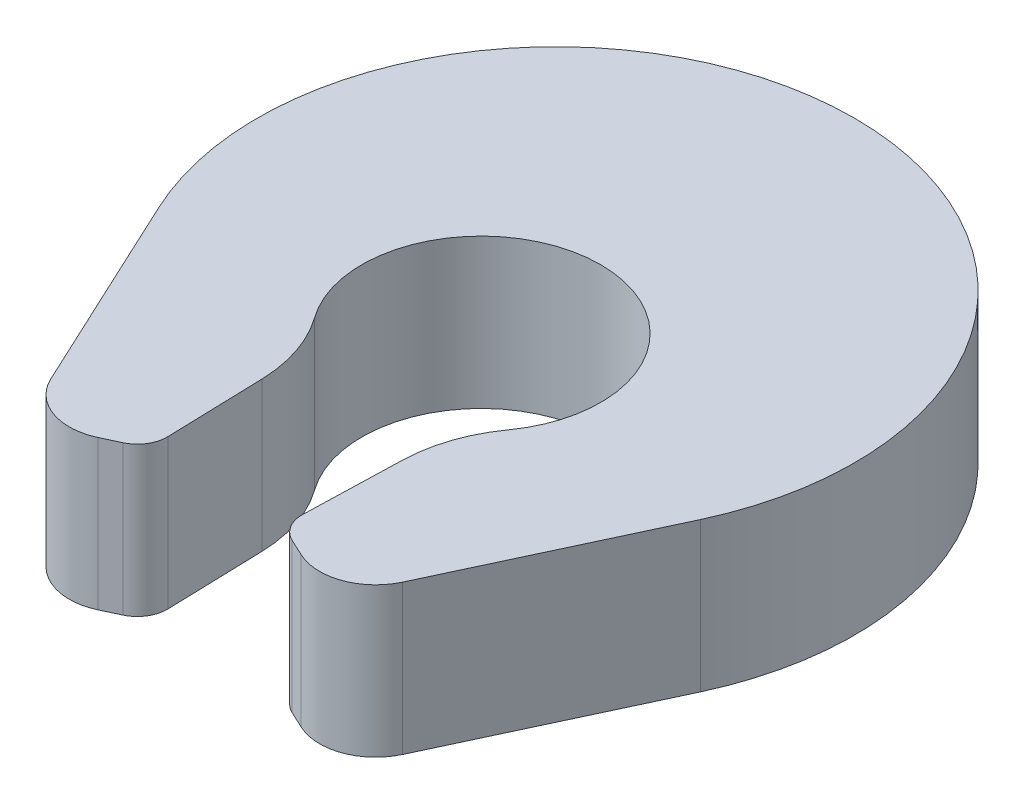
ISO-10303-21;
HEADER;
FILE_DESCRIPTION(('STEP AP214'),'2;1');
FILE_NAME('part.step','',(''),(''),'','','');
FILE_SCHEMA(('AUTOMOTIVE_DESIGN { 1 0 10303 214 1 1 1 1 }'));
ENDSEC;
DATA;
#1=APPLICATION_CONTEXT('core data for automotive mechanical design processes');
#2=APPLICATION_PROTOCOL_DEFINITION('international standard','automotive_design',2000,#1);
#3=PRODUCT_CONTEXT('',#1,'mechanical');
#4=PRODUCT('Part','Part','',(#3));
#5=PRODUCT_RELATED_PRODUCT_CATEGORY('part','',(#4));
#6=PRODUCT_DEFINITION_FORMATION('','',#4);
#7=PRODUCT_DEFINITION_CONTEXT('part definition',#1,'design');
#8=PRODUCT_DEFINITION('design','',#6,#7);
#9=PRODUCT_DEFINITION_SHAPE('','',#8);
#10=(LENGTH_UNIT() NAMED_UNIT(*) SI_UNIT(.MILLI.,.METRE.));
#11=(NAMED_UNIT(*) PLANE_ANGLE_UNIT() SI_UNIT($,.RADIAN.));
#12=(NAMED_UNIT(*) SI_UNIT($,.STERADIAN.) SOLID_ANGLE_UNIT());
#13=UNCERTAINTY_MEASURE_WITH_UNIT(LENGTH_MEASURE(1.E-05),#10,'distance_accuracy_value','');
#14=(GEOMETRIC_REPRESENTATION_CONTEXT(3) GLOBAL_UNCERTAINTY_ASSIGNED_CONTEXT((#13)) GLOBAL_UNIT_ASSIGNED_CONTEXT((#10,
#11,#12)) REPRESENTATION_CONTEXT('',''));
#15=CARTESIAN_POINT('',(0.,0.,0.));
#16=DIRECTION('',(0.,0.,1.));
#17=DIRECTION('',(1.,0.,0.));
#18=AXIS2_PLACEMENT_3D('',#15,#16,#17);
#19=CARTESIAN_POINT('',(0.,2.,0.));
#20=DIRECTION('',(0.,-1.,0.));
#21=DIRECTION('',(0.,0.,-1.));
#22=AXIS2_PLACEMENT_3D('',#19,#20,#21);
#23=CYLINDRICAL_SURFACE('',#22,4.);
#24=CARTESIAN_POINT('',(0.,0.,0.));
#25=DIRECTION('',(0.,1.,0.));
#26=DIRECTION('',(0.,0.,-1.));
#27=AXIS2_PLACEMENT_3D('',#24,#25,#26);
#28=CIRCLE('',#27,4.);
#29=CARTESIAN_POINT('',(3.62523114814661,0.,1.69047304696278));
#30=VERTEX_POINT('',#29);
#31=CARTESIAN_POINT('',(-3.62523114814661,0.,1.69047304696278));
#32=VERTEX_POINT('',#31);
#33=EDGE_CURVE('E169',#30,#32,#28,.T.);
#34=ORIENTED_EDGE('',*,*,#33,.T.);
#35=DIRECTION('',(0.,-1.,0.));
#36=VECTOR('',#35,1.);
#37=CARTESIAN_POINT('',(-3.62523114814661,2.,1.69047304696278));
#38=LINE('',#37,#36);
#39=CARTESIAN_POINT('',(-3.62523114814661,2.,1.69047304696278));
#40=VERTEX_POINT('',#39);
#41=EDGE_CURVE('E11',#40,#32,#38,.T.);
#42=ORIENTED_EDGE('',*,*,#41,.F.);
#43=CARTESIAN_POINT('',(0.,2.,0.));
#44=DIRECTION('',(0.,1.,0.));
#45=DIRECTION('',(0.,0.,-1.));
#46=AXIS2_PLACEMENT_3D('',#43,#44,#45);
#47=CIRCLE('',#46,4.);
#48=CARTESIAN_POINT('',(3.62523114814661,2.,1.69047304696278));
#49=VERTEX_POINT('',#48);
#50=EDGE_CURVE('E195',#49,#40,#47,.T.);
#51=ORIENTED_EDGE('',*,*,#50,.F.);
#52=DIRECTION('',(0.,-1.,0.));
#53=VECTOR('',#52,1.);
#54=CARTESIAN_POINT('',(3.62523114814661,2.,1.69047304696278));
#55=LINE('',#54,#53);
#56=EDGE_CURVE('E165',#49,#30,#55,.T.);
#57=ORIENTED_EDGE('',*,*,#56,.T.);
#58=EDGE_LOOP('',(#34,#42,#51,#57));
#59=FACE_BOUND('',#58,.T.);
#60=ADVANCED_FACE('F37',(#59),#23,.T.);
#61=CARTESIAN_POINT('',(-3.62523114814661,2.,1.69047304696278));
#62=DIRECTION('',(0.906307787036653,0.,-0.422618261740694));
#63=DIRECTION('',(-0.422618261740694,0.,-0.906307787036653));
#64=AXIS2_PLACEMENT_3D('',#61,#62,#63);
#65=PLANE('',#64);
#66=DIRECTION('',(0.422618261740694,0.,0.906307787036653));
#67=VECTOR('',#66,1.);
#68=CARTESIAN_POINT('',(-3.62523114814661,0.,1.69047304696278));
#69=LINE('',#68,#67);
#70=CARTESIAN_POINT('',(-2.35737636292453,0.,4.40939640807273));
#71=VERTEX_POINT('',#70);
#72=EDGE_CURVE('E172',#32,#71,#69,.T.);
#73=ORIENTED_EDGE('',*,*,#72,.T.);
#74=DIRECTION('',(0.,-1.,0.));
#75=VECTOR('',#74,1.);
#76=CARTESIAN_POINT('',(-2.35737636292453,2.,4.40939640807273));
#77=LINE('',#76,#75);
#78=CARTESIAN_POINT('',(-2.35737636292453,2.,4.40939640807273));
#79=VERTEX_POINT('',#78);
#80=EDGE_CURVE('E45',#79,#71,#77,.T.);
#81=ORIENTED_EDGE('',*,*,#80,.F.);
#82=DIRECTION('',(0.422618261740694,0.,0.906307787036653));
#83=VECTOR('',#82,1.);
#84=CARTESIAN_POINT('',(-3.62523114814661,2.,1.69047304696278));
#85=LINE('',#84,#83);
#86=EDGE_CURVE('E114',#40,#79,#85,.T.);
#87=ORIENTED_EDGE('',*,*,#86,.F.);
#88=ORIENTED_EDGE('',*,*,#41,.T.);
#89=EDGE_LOOP('',(#73,#81,#87,#88));
#90=FACE_BOUND('',#89,.T.);
#91=ADVANCED_FACE('F283',(#90),#65,.F.);
#92=CARTESIAN_POINT('',(-1.67764552264704,2.,4.09243271176721));
#93=DIRECTION('',(0.,-1.,0.));
#94=DIRECTION('',(0.,0.,-1.));
#95=AXIS2_PLACEMENT_3D('',#92,#93,#94);
#96=CYLINDRICAL_SURFACE('',#95,0.749999999999999);
#97=CARTESIAN_POINT('',(-1.67764552264704,0.,4.09243271176721));
#98=DIRECTION('',(0.,1.,0.));
#99=DIRECTION('',(0.,0.,-1.));
#100=AXIS2_PLACEMENT_3D('',#97,#98,#99);
#101=CIRCLE('',#100,0.749999999999999);
#102=CARTESIAN_POINT('',(-1.36068182634152,0.,4.7721635520447));
#103=VERTEX_POINT('',#102);
#104=EDGE_CURVE('E174',#71,#103,#101,.T.);
#105=ORIENTED_EDGE('',*,*,#104,.T.);
#106=DIRECTION('',(0.,-1.,0.));
#107=VECTOR('',#106,1.);
#108=CARTESIAN_POINT('',(-1.36068182634152,2.,4.7721635520447));
#109=LINE('',#108,#107);
#110=CARTESIAN_POINT('',(-1.36068182634152,2.,4.7721635520447));
#111=VERTEX_POINT('',#110);
#112=EDGE_CURVE('E220',#111,#103,#109,.T.);
#113=ORIENTED_EDGE('',*,*,#112,.F.);
#114=CARTESIAN_POINT('',(-1.67764552264704,2.,4.09243271176721));
#115=DIRECTION('',(0.,1.,0.));
#116=DIRECTION('',(0.,0.,-1.));
#117=AXIS2_PLACEMENT_3D('',#114,#115,#116);
#118=CIRCLE('',#117,0.749999999999999);
#119=EDGE_CURVE('E228',#79,#111,#118,.T.);
#120=ORIENTED_EDGE('',*,*,#119,.F.);
#121=ORIENTED_EDGE('',*,*,#80,.T.);
#122=EDGE_LOOP('',(#105,#113,#120,#121));
#123=FACE_BOUND('',#122,.T.);
#124=ADVANCED_FACE('F226',(#123),#96,.T.);
#125=CARTESIAN_POINT('',(-1.13410487958236,2.,4.66650898660953));
#126=DIRECTION('',(-0.422618261740695,0.,-0.906307787036652));
#127=DIRECTION('',(-0.906307787036652,0.,0.422618261740695));
#128=AXIS2_PLACEMENT_3D('',#125,#126,#127);
#129=PLANE('',#128);
#130=DIRECTION('',(0.906307787036652,0.,-0.422618261740695));
#131=VECTOR('',#130,1.);
#132=CARTESIAN_POINT('',(-1.13410487958236,0.,4.66650898660953));
#133=LINE('',#132,#131);
#134=CARTESIAN_POINT('',(-1.13410487958236,0.,4.66650898660953));
#135=VERTEX_POINT('',#134);
#136=EDGE_CURVE('E176',#103,#135,#133,.T.);
#137=ORIENTED_EDGE('',*,*,#136,.T.);
#138=DIRECTION('',(0.,-1.,0.));
#139=VECTOR('',#138,1.);
#140=CARTESIAN_POINT('',(-1.13410487958236,2.,4.66650898660953));
#141=LINE('',#140,#139);
#142=CARTESIAN_POINT('',(-1.13410487958236,2.,4.66650898660953));
#143=VERTEX_POINT('',#142);
#144=EDGE_CURVE('E217',#143,#135,#141,.T.);
#145=ORIENTED_EDGE('',*,*,#144,.F.);
#146=DIRECTION('',(0.906307787036652,0.,-0.422618261740695));
#147=VECTOR('',#146,1.);
#148=CARTESIAN_POINT('',(-1.13410487958236,2.,4.66650898660953));
#149=LINE('',#148,#147);
#150=EDGE_CURVE('E246',#111,#143,#149,.T.);
#151=ORIENTED_EDGE('',*,*,#150,.F.);
#152=ORIENTED_EDGE('',*,*,#112,.T.);
#153=EDGE_LOOP('',(#137,#145,#151,#152));
#154=FACE_BOUND('',#153,.T.);
#155=ADVANCED_FACE('F237',(#154),#129,.F.);
#156=CARTESIAN_POINT('',(-1.30315218427863,2.,4.30398587179487));
#157=DIRECTION('',(0.,-1.,0.));
#158=DIRECTION('',(0.,0.,-1.));
#159=AXIS2_PLACEMENT_3D('',#156,#157,#158);
#160=CYLINDRICAL_SURFACE('',#159,0.399999999999999);
#161=CARTESIAN_POINT('',(-1.30315218427863,0.,4.30398587179487));
#162=DIRECTION('',(0.,1.,0.));
#163=DIRECTION('',(0.,0.,-1.));
#164=AXIS2_PLACEMENT_3D('',#161,#162,#163);
#165=CIRCLE('',#164,0.399999999999999);
#166=CARTESIAN_POINT('',(-0.903326596229223,0.,4.29217489635075));
#167=VERTEX_POINT('',#166);
#168=EDGE_CURVE('E178',#135,#167,#165,.T.);
#169=ORIENTED_EDGE('',*,*,#168,.T.);
#170=DIRECTION('',(0.,-1.,0.));
#171=VECTOR('',#170,1.);
#172=CARTESIAN_POINT('',(-0.903326596229223,2.,4.29217489635075));
#173=LINE('',#172,#171);
#174=CARTESIAN_POINT('',(-0.903326596229223,2.,4.29217489635075));
#175=VERTEX_POINT('',#174);
#176=EDGE_CURVE('E214',#175,#167,#173,.T.);
#177=ORIENTED_EDGE('',*,*,#176,.F.);
#178=CARTESIAN_POINT('',(-1.30315218427863,2.,4.30398587179487));
#179=DIRECTION('',(0.,1.,0.));
#180=DIRECTION('',(0.,0.,-1.));
#181=AXIS2_PLACEMENT_3D('',#178,#179,#180);
#182=CIRCLE('',#181,0.399999999999999);
#183=EDGE_CURVE('E243',#143,#175,#182,.T.);
#184=ORIENTED_EDGE('',*,*,#183,.F.);
#185=ORIENTED_EDGE('',*,*,#144,.T.);
#186=EDGE_LOOP('',(#169,#177,#184,#185));
#187=FACE_BOUND('',#186,.T.);
#188=ADVANCED_FACE('F241',(#187),#160,.T.);
#189=CARTESIAN_POINT('',(-0.941712266422619,2.,2.99274173519016));
#190=DIRECTION('',(-0.999563970123531,0.,0.0295274386103057));
#191=DIRECTION('',(0.0295274386103057,0.,0.999563970123531));
#192=AXIS2_PLACEMENT_3D('',#189,#190,#191);
#193=PLANE('',#192);
#194=DIRECTION('',(-0.0295274386103057,0.,-0.999563970123531));
#195=VECTOR('',#194,1.);
#196=CARTESIAN_POINT('',(-0.941712266422619,0.,2.99274173519016));
#197=LINE('',#196,#195);
#198=CARTESIAN_POINT('',(-0.941712266422619,0.,2.99274173519016));
#199=VERTEX_POINT('',#198);
#200=EDGE_CURVE('E180',#167,#199,#197,.T.);
#201=ORIENTED_EDGE('',*,*,#200,.T.);
#202=DIRECTION('',(0.,-1.,0.));
#203=VECTOR('',#202,1.);
#204=CARTESIAN_POINT('',(-0.941712266422619,2.,2.99274173519016));
#205=LINE('',#204,#203);
#206=CARTESIAN_POINT('',(-0.941712266422619,2.,2.99274173519016));
#207=VERTEX_POINT('',#206);
#208=EDGE_CURVE('E211',#207,#199,#205,.T.);
#209=ORIENTED_EDGE('',*,*,#208,.F.);
#210=DIRECTION('',(-0.0295274386103057,0.,-0.999563970123531));
#211=VECTOR('',#210,1.);
#212=CARTESIAN_POINT('',(-0.941712266422619,2.,2.99274173519016));
#213=LINE('',#212,#211);
#214=EDGE_CURVE('E245',#175,#207,#213,.T.);
#215=ORIENTED_EDGE('',*,*,#214,.F.);
#216=ORIENTED_EDGE('',*,*,#176,.T.);
#217=EDGE_LOOP('',(#201,#209,#215,#216));
#218=FACE_BOUND('',#217,.T.);
#219=ADVANCED_FACE('F296',(#218),#193,.F.);
#220=CARTESIAN_POINT('',(-2.85619910846211,2.,3.04929628736311));
#221=DIRECTION('',(0.,-1.,0.));
#222=DIRECTION('',(0.,0.,-1.));
#223=AXIS2_PLACEMENT_3D('',#220,#221,#222);
#224=CYLINDRICAL_SURFACE('',#223,1.91532197964568);
#225=CARTESIAN_POINT('',(-2.85619910846211,0.,3.04929628736311));
#226=DIRECTION('',(0.,1.,0.));
#227=DIRECTION('',(0.,0.,-1.));
#228=AXIS2_PLACEMENT_3D('',#225,#226,#227);
#229=CIRCLE('',#228,1.91532197964568);
#230=CARTESIAN_POINT('',(-1.3,0.,1.93273790530888));
#231=VERTEX_POINT('',#230);
#232=EDGE_CURVE('E182',#199,#231,#229,.T.);
#233=ORIENTED_EDGE('',*,*,#232,.T.);
#234=DIRECTION('',(0.,-1.,0.));
#235=VECTOR('',#234,1.);
#236=CARTESIAN_POINT('',(-1.3,2.,1.93273790530888));
#237=LINE('',#236,#235);
#238=CARTESIAN_POINT('',(-1.3,2.,1.93273790530888));
#239=VERTEX_POINT('',#238);
#240=EDGE_CURVE('E208',#239,#231,#237,.T.);
#241=ORIENTED_EDGE('',*,*,#240,.F.);
#242=CARTESIAN_POINT('',(-2.85619910846211,2.,3.04929628736311));
#243=DIRECTION('',(0.,1.,0.));
#244=DIRECTION('',(0.,0.,-1.));
#245=AXIS2_PLACEMENT_3D('',#242,#243,#244);
#246=CIRCLE('',#245,1.91532197964568);
#247=EDGE_CURVE('E248',#207,#239,#246,.T.);
#248=ORIENTED_EDGE('',*,*,#247,.F.);
#249=ORIENTED_EDGE('',*,*,#208,.T.);
#250=EDGE_LOOP('',(#233,#241,#248,#249));
#251=FACE_BOUND('',#250,.T.);
#252=ADVANCED_FACE('F299',(#251),#224,.T.);
#253=CARTESIAN_POINT('',(0.,2.,1.));
#254=DIRECTION('',(0.,-1.,0.));
#255=DIRECTION('',(0.,0.,-1.));
#256=AXIS2_PLACEMENT_3D('',#253,#254,#255);
#257=CYLINDRICAL_SURFACE('',#256,1.6);
#258=CARTESIAN_POINT('',(0.,0.,1.));
#259=DIRECTION('',(0.,-1.,0.));
#260=DIRECTION('',(0.,0.,-1.));
#261=AXIS2_PLACEMENT_3D('',#258,#259,#260);
#262=CIRCLE('',#261,1.6);
#263=CARTESIAN_POINT('',(1.3,0.,1.93273790530888));
#264=VERTEX_POINT('',#263);
#265=EDGE_CURVE('E184',#231,#264,#262,.T.);
#266=ORIENTED_EDGE('',*,*,#265,.T.);
#267=DIRECTION('',(0.,-1.,0.));
#268=VECTOR('',#267,1.);
#269=CARTESIAN_POINT('',(1.3,2.,1.93273790530888));
#270=LINE('',#269,#268);
#271=CARTESIAN_POINT('',(1.3,2.,1.93273790530888));
#272=VERTEX_POINT('',#271);
#273=EDGE_CURVE('E205',#272,#264,#270,.T.);
#274=ORIENTED_EDGE('',*,*,#273,.F.);
#275=CARTESIAN_POINT('',(0.,2.,1.));
#276=DIRECTION('',(0.,-1.,0.));
#277=DIRECTION('',(0.,0.,-1.));
#278=AXIS2_PLACEMENT_3D('',#275,#276,#277);
#279=CIRCLE('',#278,1.6);
#280=EDGE_CURVE('E254',#239,#272,#279,.T.);
#281=ORIENTED_EDGE('',*,*,#280,.F.);
#282=ORIENTED_EDGE('',*,*,#240,.T.);
#283=EDGE_LOOP('',(#266,#274,#281,#282));
#284=FACE_BOUND('',#283,.T.);
#285=ADVANCED_FACE('F303',(#284),#257,.F.);
#286=CARTESIAN_POINT('',(2.85619910846211,2.,3.04929628736311));
#287=DIRECTION('',(0.,-1.,0.));
#288=DIRECTION('',(0.,0.,-1.));
#289=AXIS2_PLACEMENT_3D('',#286,#287,#288);
#290=CYLINDRICAL_SURFACE('',#289,1.91532197964568);
#291=CARTESIAN_POINT('',(2.85619910846211,0.,3.04929628736311));
#292=DIRECTION('',(0.,1.,0.));
#293=DIRECTION('',(0.,0.,1.));
#294=AXIS2_PLACEMENT_3D('',#291,#292,#293);
#295=CIRCLE('',#294,1.91532197964568);
#296=CARTESIAN_POINT('',(0.941712266422619,0.,2.99274173519016));
#297=VERTEX_POINT('',#296);
#298=EDGE_CURVE('E186',#264,#297,#295,.T.);
#299=ORIENTED_EDGE('',*,*,#298,.T.);
#300=DIRECTION('',(0.,-1.,0.));
#301=VECTOR('',#300,1.);
#302=CARTESIAN_POINT('',(0.941712266422619,2.,2.99274173519016));
#303=LINE('',#302,#301);
#304=CARTESIAN_POINT('',(0.941712266422619,2.,2.99274173519016));
#305=VERTEX_POINT('',#304);
#306=EDGE_CURVE('E202',#305,#297,#303,.T.);
#307=ORIENTED_EDGE('',*,*,#306,.F.);
#308=CARTESIAN_POINT('',(2.85619910846211,2.,3.04929628736311));
#309=DIRECTION('',(0.,1.,0.));
#310=DIRECTION('',(0.,0.,1.));
#311=AXIS2_PLACEMENT_3D('',#308,#309,#310);
#312=CIRCLE('',#311,1.91532197964568);
#313=EDGE_CURVE('E256',#272,#305,#312,.T.);
#314=ORIENTED_EDGE('',*,*,#313,.F.);
#315=ORIENTED_EDGE('',*,*,#273,.T.);
#316=EDGE_LOOP('',(#299,#307,#314,#315));
#317=FACE_BOUND('',#316,.T.);
#318=ADVANCED_FACE('F307',(#317),#290,.T.);
#319=CARTESIAN_POINT('',(0.941712266422619,2.,2.99274173519016));
#320=DIRECTION('',(0.999563970123531,0.,0.0295274386103057));
#321=DIRECTION('',(0.0295274386103057,0.,-0.999563970123531));
#322=AXIS2_PLACEMENT_3D('',#319,#320,#321);
#323=PLANE('',#322);
#324=DIRECTION('',(-0.0295274386103057,0.,0.999563970123531));
#325=VECTOR('',#324,1.);
#326=CARTESIAN_POINT('',(0.941712266422619,0.,2.99274173519016));
#327=LINE('',#326,#325);
#328=CARTESIAN_POINT('',(0.903326596229222,0.,4.29217489635075));
#329=VERTEX_POINT('',#328);
#330=EDGE_CURVE('E188',#297,#329,#327,.T.);
#331=ORIENTED_EDGE('',*,*,#330,.T.);
#332=DIRECTION('',(0.,-1.,0.));
#333=VECTOR('',#332,1.);
#334=CARTESIAN_POINT('',(0.903326596229222,2.,4.29217489635075));
#335=LINE('',#334,#333);
#336=CARTESIAN_POINT('',(0.903326596229222,2.,4.29217489635075));
#337=VERTEX_POINT('',#336);
#338=EDGE_CURVE('E199',#337,#329,#335,.T.);
#339=ORIENTED_EDGE('',*,*,#338,.F.);
#340=DIRECTION('',(-0.0295274386103057,0.,0.999563970123531));
#341=VECTOR('',#340,1.);
#342=CARTESIAN_POINT('',(0.941712266422619,2.,2.99274173519016));
#343=LINE('',#342,#341);
#344=EDGE_CURVE('E258',#305,#337,#343,.T.);
#345=ORIENTED_EDGE('',*,*,#344,.F.);
#346=ORIENTED_EDGE('',*,*,#306,.T.);
#347=EDGE_LOOP('',(#331,#339,#345,#346));
#348=FACE_BOUND('',#347,.T.);
#349=ADVANCED_FACE('F264',(#348),#323,.F.);
#350=CARTESIAN_POINT('',(1.30315218427864,2.,4.30398587179487));
#351=DIRECTION('',(0.,-1.,0.));
#352=DIRECTION('',(0.,0.,-1.));
#353=AXIS2_PLACEMENT_3D('',#350,#351,#352);
#354=CYLINDRICAL_SURFACE('',#353,0.4);
#355=CARTESIAN_POINT('',(1.30315218427864,0.,4.30398587179487));
#356=DIRECTION('',(0.,1.,0.));
#357=DIRECTION('',(0.,0.,-1.));
#358=AXIS2_PLACEMENT_3D('',#355,#356,#357);
#359=CIRCLE('',#358,0.4);
#360=CARTESIAN_POINT('',(1.13410487958236,0.,4.66650898660953));
#361=VERTEX_POINT('',#360);
#362=EDGE_CURVE('E190',#329,#361,#359,.T.);
#363=ORIENTED_EDGE('',*,*,#362,.T.);
#364=DIRECTION('',(0.,-1.,0.));
#365=VECTOR('',#364,1.);
#366=CARTESIAN_POINT('',(1.13410487958236,2.,4.66650898660953));
#367=LINE('',#366,#365);
#368=CARTESIAN_POINT('',(1.13410487958236,2.,4.66650898660953));
#369=VERTEX_POINT('',#368);
#370=EDGE_CURVE('E160',#369,#361,#367,.T.);
#371=ORIENTED_EDGE('',*,*,#370,.F.);
#372=CARTESIAN_POINT('',(1.30315218427864,2.,4.30398587179487));
#373=DIRECTION('',(0.,1.,0.));
#374=DIRECTION('',(0.,0.,-1.));
#375=AXIS2_PLACEMENT_3D('',#372,#373,#374);
#376=CIRCLE('',#375,0.4);
#377=EDGE_CURVE('E151',#337,#369,#376,.T.);
#378=ORIENTED_EDGE('',*,*,#377,.F.);
#379=ORIENTED_EDGE('',*,*,#338,.T.);
#380=EDGE_LOOP('',(#363,#371,#378,#379));
#381=FACE_BOUND('',#380,.T.);
#382=ADVANCED_FACE('F268',(#381),#354,.T.);
#383=CARTESIAN_POINT('',(1.13410487958236,2.,4.66650898660953));
#384=DIRECTION('',(0.422618261740698,0.,-0.906307787036651));
#385=DIRECTION('',(-0.906307787036651,0.,-0.422618261740698));
#386=AXIS2_PLACEMENT_3D('',#383,#384,#385);
#387=PLANE('',#386);
#388=DIRECTION('',(0.906307787036651,0.,0.422618261740698));
#389=VECTOR('',#388,1.);
#390=CARTESIAN_POINT('',(1.13410487958236,0.,4.66650898660953));
#391=LINE('',#390,#389);
#392=CARTESIAN_POINT('',(1.36068182634152,0.,4.7721635520447));
#393=VERTEX_POINT('',#392);
#394=EDGE_CURVE('E159',#361,#393,#391,.T.);
#395=ORIENTED_EDGE('',*,*,#394,.T.);
#396=DIRECTION('',(0.,-1.,0.));
#397=VECTOR('',#396,1.);
#398=CARTESIAN_POINT('',(1.36068182634152,2.,4.7721635520447));
#399=LINE('',#398,#397);
#400=CARTESIAN_POINT('',(1.36068182634152,2.,4.7721635520447));
#401=VERTEX_POINT('',#400);
#402=EDGE_CURVE('E156',#401,#393,#399,.T.);
#403=ORIENTED_EDGE('',*,*,#402,.F.);
#404=DIRECTION('',(0.906307787036651,0.,0.422618261740698));
#405=VECTOR('',#404,1.);
#406=CARTESIAN_POINT('',(1.13410487958236,2.,4.66650898660953));
#407=LINE('',#406,#405);
#408=EDGE_CURVE('E145',#369,#401,#407,.T.);
#409=ORIENTED_EDGE('',*,*,#408,.F.);
#410=ORIENTED_EDGE('',*,*,#370,.T.);
#411=EDGE_LOOP('',(#395,#403,#409,#410));
#412=FACE_BOUND('',#411,.T.);
#413=ADVANCED_FACE('F157',(#412),#387,.F.);
#414=CARTESIAN_POINT('',(1.67764552264704,2.,4.09243271176721));
#415=DIRECTION('',(0.,-1.,0.));
#416=DIRECTION('',(0.,0.,-1.));
#417=AXIS2_PLACEMENT_3D('',#414,#415,#416);
#418=CYLINDRICAL_SURFACE('',#417,0.75);
#419=CARTESIAN_POINT('',(1.67764552264704,0.,4.09243271176721));
#420=DIRECTION('',(0.,1.,0.));
#421=DIRECTION('',(0.,0.,1.));
#422=AXIS2_PLACEMENT_3D('',#419,#420,#421);
#423=CIRCLE('',#422,0.75);
#424=CARTESIAN_POINT('',(2.35737636292453,0.,4.40939640807273));
#425=VERTEX_POINT('',#424);
#426=EDGE_CURVE('E100',#393,#425,#423,.T.);
#427=ORIENTED_EDGE('',*,*,#426,.T.);
#428=DIRECTION('',(0.,-1.,0.));
#429=VECTOR('',#428,1.);
#430=CARTESIAN_POINT('',(2.35737636292453,2.,4.40939640807273));
#431=LINE('',#430,#429);
#432=CARTESIAN_POINT('',(2.35737636292453,2.,4.40939640807273));
#433=VERTEX_POINT('',#432);
#434=EDGE_CURVE('E161',#433,#425,#431,.T.);
#435=ORIENTED_EDGE('',*,*,#434,.F.);
#436=CARTESIAN_POINT('',(1.67764552264704,2.,4.09243271176721));
#437=DIRECTION('',(0.,1.,0.));
#438=DIRECTION('',(0.,0.,1.));
#439=AXIS2_PLACEMENT_3D('',#436,#437,#438);
#440=CIRCLE('',#439,0.75);
#441=EDGE_CURVE('E149',#401,#433,#440,.T.);
#442=ORIENTED_EDGE('',*,*,#441,.F.);
#443=ORIENTED_EDGE('',*,*,#402,.T.);
#444=EDGE_LOOP('',(#427,#435,#442,#443));
#445=FACE_BOUND('',#444,.T.);
#446=ADVANCED_FACE('F163',(#445),#418,.T.);
#447=CARTESIAN_POINT('',(3.62523114814661,2.,1.69047304696278));
#448=DIRECTION('',(-0.906307787036653,0.,-0.422618261740694));
#449=DIRECTION('',(-0.422618261740694,0.,0.906307787036653));
#450=AXIS2_PLACEMENT_3D('',#447,#448,#449);
#451=PLANE('',#450);
#452=DIRECTION('',(0.422618261740694,0.,-0.906307787036653));
#453=VECTOR('',#452,1.);
#454=CARTESIAN_POINT('',(3.62523114814661,0.,1.69047304696278));
#455=LINE('',#454,#453);
#456=EDGE_CURVE('E106',#425,#30,#455,.T.);
#457=ORIENTED_EDGE('',*,*,#456,.T.);
#458=ORIENTED_EDGE('',*,*,#56,.F.);
#459=DIRECTION('',(0.422618261740694,0.,-0.906307787036653));
#460=VECTOR('',#459,1.);
#461=CARTESIAN_POINT('',(3.62523114814661,2.,1.69047304696278));
#462=LINE('',#461,#460);
#463=EDGE_CURVE('E53',#433,#49,#462,.T.);
#464=ORIENTED_EDGE('',*,*,#463,.F.);
#465=ORIENTED_EDGE('',*,*,#434,.T.);
#466=EDGE_LOOP('',(#457,#458,#464,#465));
#467=FACE_BOUND('',#466,.T.);
#468=ADVANCED_FACE('F272',(#467),#451,.F.);
#469=CARTESIAN_POINT('',(0.,2.,0.));
#470=DIRECTION('',(0.,-1.,0.));
#471=DIRECTION('',(0.,0.,-1.));
#472=AXIS2_PLACEMENT_3D('',#469,#470,#471);
#473=PLANE('',#472);
#474=ORIENTED_EDGE('',*,*,#50,.T.);
#475=ORIENTED_EDGE('',*,*,#86,.T.);
#476=ORIENTED_EDGE('',*,*,#119,.T.);
#477=ORIENTED_EDGE('',*,*,#150,.T.);
#478=ORIENTED_EDGE('',*,*,#183,.T.);
#479=ORIENTED_EDGE('',*,*,#214,.T.);
#480=ORIENTED_EDGE('',*,*,#247,.T.);
#481=ORIENTED_EDGE('',*,*,#280,.T.);
#482=ORIENTED_EDGE('',*,*,#313,.T.);
#483=ORIENTED_EDGE('',*,*,#344,.T.);
#484=ORIENTED_EDGE('',*,*,#377,.T.);
#485=ORIENTED_EDGE('',*,*,#408,.T.);
#486=ORIENTED_EDGE('',*,*,#441,.T.);
#487=ORIENTED_EDGE('',*,*,#463,.T.);
#488=EDGE_LOOP('',(#474,#475,#476,#477,#478,#479,#480,#481,#482,#483,#484,#485,#486,#487));
#489=FACE_BOUND('',#488,.T.);
#490=ADVANCED_FACE('F147',(#489),#473,.F.);
#491=CARTESIAN_POINT('',(0.,0.,0.));
#492=DIRECTION('',(0.,-1.,0.));
#493=DIRECTION('',(0.,0.,-1.));
#494=AXIS2_PLACEMENT_3D('',#491,#492,#493);
#495=PLANE('',#494);
#496=ORIENTED_EDGE('',*,*,#33,.F.);
#497=ORIENTED_EDGE('',*,*,#456,.F.);
#498=ORIENTED_EDGE('',*,*,#426,.F.);
#499=ORIENTED_EDGE('',*,*,#394,.F.);
#500=ORIENTED_EDGE('',*,*,#362,.F.);
#501=ORIENTED_EDGE('',*,*,#330,.F.);
#502=ORIENTED_EDGE('',*,*,#298,.F.);
#503=ORIENTED_EDGE('',*,*,#265,.F.);
#504=ORIENTED_EDGE('',*,*,#232,.F.);
#505=ORIENTED_EDGE('',*,*,#200,.F.);
#506=ORIENTED_EDGE('',*,*,#168,.F.);
#507=ORIENTED_EDGE('',*,*,#136,.F.);
#508=ORIENTED_EDGE('',*,*,#104,.F.);
#509=ORIENTED_EDGE('',*,*,#72,.F.);
#510=EDGE_LOOP('',(#496,#497,#498,#499,#500,#501,#502,#503,#504,#505,#506,#507,#508,#509));
#511=FACE_BOUND('',#510,.T.);
#512=ADVANCED_FACE('F232',(#511),#495,.T.);
#513=CLOSED_SHELL('',(#60,#91,#124,#155,#188,#219,#252,#285,#318,#349,#382,#413,#446,#468,#490,#512));
#514=MANIFOLD_SOLID_BREP('B2',#513);
#515=ADVANCED_BREP_SHAPE_REPRESENTATION('',(#18,#514),#14);
#516=SHAPE_DEFINITION_REPRESENTATION(#9,#515);
ENDSEC;
END-ISO-10303-21;
